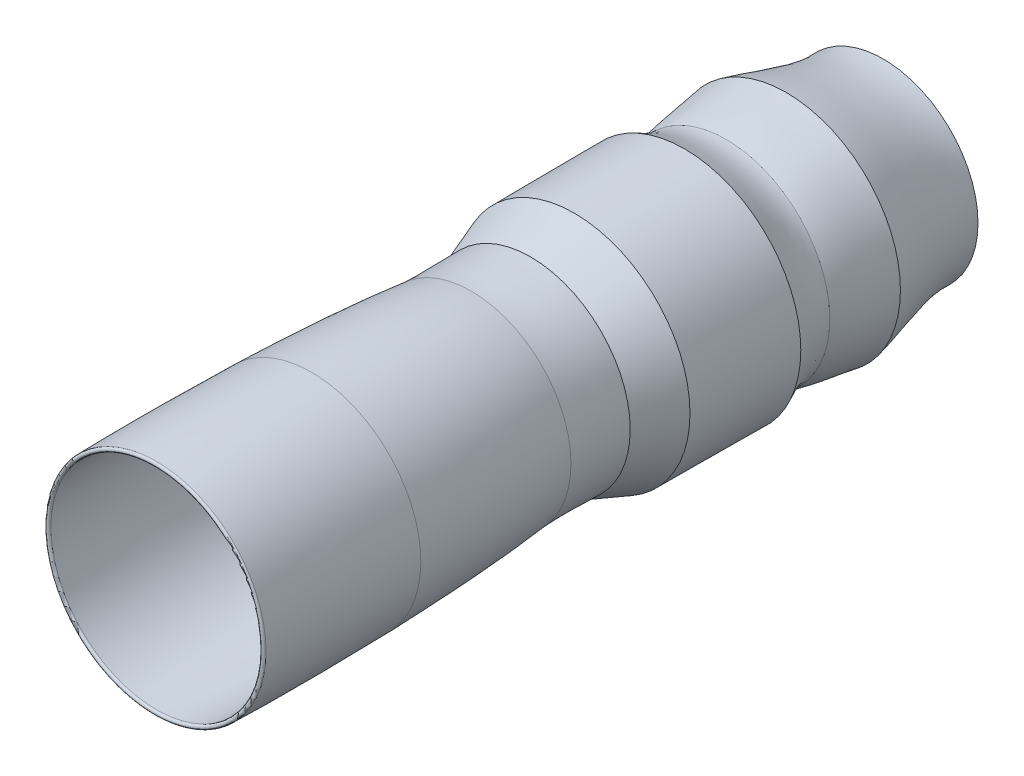
ISO-10303-21;
HEADER;
FILE_DESCRIPTION(('STEP AP214'),'2;1');
FILE_NAME('part.step','',(''),(''),'','','');
FILE_SCHEMA(('AUTOMOTIVE_DESIGN { 1 0 10303 214 1 1 1 1 }'));
ENDSEC;
DATA;
#1=APPLICATION_CONTEXT('core data for automotive mechanical design processes');
#2=APPLICATION_PROTOCOL_DEFINITION('international standard','automotive_design',2000,#1);
#3=PRODUCT_CONTEXT('',#1,'mechanical');
#4=PRODUCT('Part','Part','',(#3));
#5=PRODUCT_RELATED_PRODUCT_CATEGORY('part','',(#4));
#6=PRODUCT_DEFINITION_FORMATION('','',#4);
#7=PRODUCT_DEFINITION_CONTEXT('part definition',#1,'design');
#8=PRODUCT_DEFINITION('design','',#6,#7);
#9=PRODUCT_DEFINITION_SHAPE('','',#8);
#10=(LENGTH_UNIT() NAMED_UNIT(*) SI_UNIT(.MILLI.,.METRE.));
#11=(NAMED_UNIT(*) PLANE_ANGLE_UNIT() SI_UNIT($,.RADIAN.));
#12=(NAMED_UNIT(*) SI_UNIT($,.STERADIAN.) SOLID_ANGLE_UNIT());
#13=UNCERTAINTY_MEASURE_WITH_UNIT(LENGTH_MEASURE(1.E-05),#10,'distance_accuracy_value','');
#14=(GEOMETRIC_REPRESENTATION_CONTEXT(3) GLOBAL_UNCERTAINTY_ASSIGNED_CONTEXT((#13)) GLOBAL_UNIT_ASSIGNED_CONTEXT((#10,
#11,#12)) REPRESENTATION_CONTEXT('',''));
#15=CARTESIAN_POINT('',(0.,0.,0.));
#16=DIRECTION('',(0.,0.,1.));
#17=DIRECTION('',(1.,0.,0.));
#18=AXIS2_PLACEMENT_3D('',#15,#16,#17);
#19=CARTESIAN_POINT('',(0.,753.494292529718,-356.161187989445));
#20=CARTESIAN_POINT('',(0.,760.172113123118,-725.110775774774));
#21=CARTESIAN_POINT('',(0.,758.434084398831,-1094.10200615055));
#22=CARTESIAN_POINT('',(0.,750.66302289733,-1463.187614253));
#23=B_SPLINE_CURVE_WITH_KNOTS('',3,(#19,#20,#21,#22),.UNSPECIFIED.,.F.,.F.,(4,4),(0.,1.),.UNSPECIFIED.);
#24=CARTESIAN_POINT('',(0.,0.,0.));
#25=DIRECTION('',(0.,0.,1.));
#26=AXIS1_PLACEMENT('',#24,#25);
#27=SURFACE_OF_REVOLUTION('',#23,#26);
#28=CARTESIAN_POINT('',(0.,0.,-1463.187614253));
#29=DIRECTION('',(0.,0.,1.));
#30=DIRECTION('',(1.,0.,0.));
#31=AXIS2_PLACEMENT_3D('',#28,#29,#30);
#32=CIRCLE('',#31,750.66302289733);
#33=CARTESIAN_POINT('',(750.66302289733,0.,-1463.187614253));
#34=VERTEX_POINT('',#33);
#35=EDGE_CURVE('E10',#34,#34,#32,.T.);
#36=ORIENTED_EDGE('',*,*,#35,.F.);
#37=EDGE_LOOP('',(#36));
#38=FACE_BOUND('',#37,.T.);
#39=CARTESIAN_POINT('',(0.,0.,-356.161187989445));
#40=DIRECTION('',(0.,0.,1.));
#41=DIRECTION('',(1.,0.,0.));
#42=AXIS2_PLACEMENT_3D('',#39,#40,#41);
#43=CIRCLE('',#42,753.494292529718);
#44=CARTESIAN_POINT('',(753.494292529718,0.,-356.161187989445));
#45=VERTEX_POINT('',#44);
#46=EDGE_CURVE('E92',#45,#45,#43,.T.);
#47=ORIENTED_EDGE('',*,*,#46,.T.);
#48=EDGE_LOOP('',(#47));
#49=FACE_BOUND('',#48,.T.);
#50=ADVANCED_FACE('F33',(#38,#49),#27,.T.);
#51=CARTESIAN_POINT('',(0.,750.66302289733,-1463.187614253));
#52=CARTESIAN_POINT('',(0.,737.201686938237,-1843.51900634968));
#53=CARTESIAN_POINT('',(0.,724.679123309834,-2224.42989755984));
#54=CARTESIAN_POINT('',(0.,681.874551433211,-2602.8220839904));
#55=B_SPLINE_CURVE_WITH_KNOTS('',3,(#51,#52,#53,#54),.UNSPECIFIED.,.F.,.F.,(4,4),(0.,1.),.UNSPECIFIED.);
#56=CARTESIAN_POINT('',(0.,0.,0.));
#57=DIRECTION('',(0.,0.,1.));
#58=AXIS1_PLACEMENT('',#56,#57);
#59=SURFACE_OF_REVOLUTION('',#55,#58);
#60=CARTESIAN_POINT('',(0.,0.,-2602.8220839904));
#61=DIRECTION('',(0.,0.,1.));
#62=DIRECTION('',(1.,0.,0.));
#63=AXIS2_PLACEMENT_3D('',#60,#61,#62);
#64=CIRCLE('',#63,681.874551433211);
#65=CARTESIAN_POINT('',(681.874551433211,0.,-2602.8220839904));
#66=VERTEX_POINT('',#65);
#67=EDGE_CURVE('E40',#66,#66,#64,.T.);
#68=ORIENTED_EDGE('',*,*,#67,.F.);
#69=EDGE_LOOP('',(#68));
#70=FACE_BOUND('',#69,.T.);
#71=ORIENTED_EDGE('',*,*,#35,.T.);
#72=EDGE_LOOP('',(#71));
#73=FACE_BOUND('',#72,.T.);
#74=ADVANCED_FACE('F210',(#70,#73),#59,.T.);
#75=CARTESIAN_POINT('',(0.,681.874551433211,-2602.8220839904));
#76=CARTESIAN_POINT('',(0.,673.149714518346,-2746.4510287299));
#77=CARTESIAN_POINT('',(0.,679.394025231765,-2890.10518217993));
#78=CARTESIAN_POINT('',(0.,681.748596070962,-3034.50316192965));
#79=B_SPLINE_CURVE_WITH_KNOTS('',3,(#75,#76,#77,#78),.UNSPECIFIED.,.F.,.F.,(4,4),(0.,1.),.UNSPECIFIED.);
#80=CARTESIAN_POINT('',(0.,0.,0.));
#81=DIRECTION('',(0.,0.,1.));
#82=AXIS1_PLACEMENT('',#80,#81);
#83=SURFACE_OF_REVOLUTION('',#79,#82);
#84=CARTESIAN_POINT('',(0.,0.,-3034.50316192965));
#85=DIRECTION('',(0.,0.,1.));
#86=DIRECTION('',(1.,0.,0.));
#87=AXIS2_PLACEMENT_3D('',#84,#85,#86);
#88=CIRCLE('',#87,681.748596070962);
#89=CARTESIAN_POINT('',(681.748596070962,0.,-3034.50316192965));
#90=VERTEX_POINT('',#89);
#91=EDGE_CURVE('E44',#90,#90,#88,.T.);
#92=ORIENTED_EDGE('',*,*,#91,.F.);
#93=EDGE_LOOP('',(#92));
#94=FACE_BOUND('',#93,.T.);
#95=ORIENTED_EDGE('',*,*,#67,.T.);
#96=EDGE_LOOP('',(#95));
#97=FACE_BOUND('',#96,.T.);
#98=ADVANCED_FACE('F207',(#94,#97),#83,.T.);
#99=CARTESIAN_POINT('',(0.,0.,-3034.50316192965));
#100=DIRECTION('',(0.,0.,-1.));
#101=DIRECTION('',(-1.,0.,0.));
#102=AXIS2_PLACEMENT_3D('',#99,#100,#101);
#103=CONICAL_SURFACE('',#102,681.748596070962,0.349679327620041);
#104=CARTESIAN_POINT('',(0.,0.,-3347.18801790438));
#105=DIRECTION('',(0.,0.,1.));
#106=DIRECTION('',(1.,0.,0.));
#107=AXIS2_PLACEMENT_3D('',#104,#105,#106);
#108=CIRCLE('',#107,795.773861825972);
#109=CARTESIAN_POINT('',(795.773861825972,0.,-3347.18801790438));
#110=VERTEX_POINT('',#109);
#111=EDGE_CURVE('E48',#110,#110,#108,.T.);
#112=ORIENTED_EDGE('',*,*,#111,.F.);
#113=EDGE_LOOP('',(#112));
#114=FACE_BOUND('',#113,.T.);
#115=ORIENTED_EDGE('',*,*,#91,.T.);
#116=EDGE_LOOP('',(#115));
#117=FACE_BOUND('',#116,.T.);
#118=ADVANCED_FACE('F209',(#114,#117),#103,.F.);
#119=CARTESIAN_POINT('',(0.,0.,-3347.18801790438));
#120=DIRECTION('',(0.,0.,-1.));
#121=DIRECTION('',(-1.,0.,0.));
#122=AXIS2_PLACEMENT_3D('',#119,#120,#121);
#123=CONICAL_SURFACE('',#122,795.773861825972,0.00551040441850811);
#124=CARTESIAN_POINT('',(0.,0.,-4122.34696172726));
#125=DIRECTION('',(0.,0.,1.));
#126=DIRECTION('',(1.,0.,0.));
#127=AXIS2_PLACEMENT_3D('',#124,#125,#126);
#128=CIRCLE('',#127,800.045344329039);
#129=CARTESIAN_POINT('',(800.045344329039,0.,-4122.34696172726));
#130=VERTEX_POINT('',#129);
#131=EDGE_CURVE('E53',#130,#130,#128,.T.);
#132=ORIENTED_EDGE('',*,*,#131,.F.);
#133=EDGE_LOOP('',(#132));
#134=FACE_BOUND('',#133,.T.);
#135=ORIENTED_EDGE('',*,*,#111,.T.);
#136=EDGE_LOOP('',(#135));
#137=FACE_BOUND('',#136,.T.);
#138=ADVANCED_FACE('F186',(#134,#137),#123,.F.);
#139=CARTESIAN_POINT('',(0.,800.045344329039,-4122.34696172726));
#140=CARTESIAN_POINT('',(0.,754.252085999033,-4218.88190490379));
#141=CARTESIAN_POINT('',(0.,701.137630048925,-4321.24126433802));
#142=CARTESIAN_POINT('',(0.,711.434963380804,-4430.39299765593));
#143=B_SPLINE_CURVE_WITH_KNOTS('',3,(#139,#140,#141,#142),.UNSPECIFIED.,.F.,.F.,(4,4),(0.,1.),.UNSPECIFIED.);
#144=CARTESIAN_POINT('',(0.,0.,0.));
#145=DIRECTION('',(0.,0.,1.));
#146=AXIS1_PLACEMENT('',#144,#145);
#147=SURFACE_OF_REVOLUTION('',#143,#146);
#148=CARTESIAN_POINT('',(0.,0.,-4430.39299765593));
#149=DIRECTION('',(0.,0.,1.));
#150=DIRECTION('',(1.,0.,0.));
#151=AXIS2_PLACEMENT_3D('',#148,#149,#150);
#152=CIRCLE('',#151,711.434963380804);
#153=CARTESIAN_POINT('',(711.434963380804,0.,-4430.39299765593));
#154=VERTEX_POINT('',#153);
#155=EDGE_CURVE('E56',#154,#154,#152,.T.);
#156=ORIENTED_EDGE('',*,*,#155,.F.);
#157=EDGE_LOOP('',(#156));
#158=FACE_BOUND('',#157,.T.);
#159=ORIENTED_EDGE('',*,*,#131,.T.);
#160=EDGE_LOOP('',(#159));
#161=FACE_BOUND('',#160,.T.);
#162=ADVANCED_FACE('F182',(#158,#161),#147,.T.);
#163=CARTESIAN_POINT('',(0.,711.434963380804,-4430.39299765593));
#164=CARTESIAN_POINT('',(0.,749.566522084598,-4568.68704470257));
#165=CARTESIAN_POINT('',(0.,760.575182456363,-4711.69074306238));
#166=CARTESIAN_POINT('',(0.,784.956999196679,-4854.43054694721));
#167=B_SPLINE_CURVE_WITH_KNOTS('',3,(#163,#164,#165,#166),.UNSPECIFIED.,.F.,.F.,(4,4),(0.,1.),.UNSPECIFIED.);
#168=CARTESIAN_POINT('',(0.,0.,0.));
#169=DIRECTION('',(0.,0.,1.));
#170=AXIS1_PLACEMENT('',#168,#169);
#171=SURFACE_OF_REVOLUTION('',#167,#170);
#172=CARTESIAN_POINT('',(0.,0.,-4854.43054694721));
#173=DIRECTION('',(0.,0.,1.));
#174=DIRECTION('',(1.,0.,0.));
#175=AXIS2_PLACEMENT_3D('',#172,#173,#174);
#176=CIRCLE('',#175,784.956999196679);
#177=CARTESIAN_POINT('',(784.956999196679,0.,-4854.43054694721));
#178=VERTEX_POINT('',#177);
#179=EDGE_CURVE('E59',#178,#178,#176,.T.);
#180=ORIENTED_EDGE('',*,*,#179,.F.);
#181=EDGE_LOOP('',(#180));
#182=FACE_BOUND('',#181,.T.);
#183=ORIENTED_EDGE('',*,*,#155,.T.);
#184=EDGE_LOOP('',(#183));
#185=FACE_BOUND('',#184,.T.);
#186=ADVANCED_FACE('F178',(#182,#185),#171,.T.);
#187=CARTESIAN_POINT('',(0.,784.956999196679,-4854.43054694721));
#188=CARTESIAN_POINT('',(0.,731.788805229973,-5084.73900632817));
#189=CARTESIAN_POINT('',(0.,632.925530553312,-5313.76210592552));
#190=CARTESIAN_POINT('',(0.,646.823990311028,-5549.94392687975));
#191=B_SPLINE_CURVE_WITH_KNOTS('',3,(#187,#188,#189,#190),.UNSPECIFIED.,.F.,.F.,(4,4),(0.,1.),.UNSPECIFIED.);
#192=CARTESIAN_POINT('',(0.,0.,0.));
#193=DIRECTION('',(0.,0.,1.));
#194=AXIS1_PLACEMENT('',#192,#193);
#195=SURFACE_OF_REVOLUTION('',#191,#194);
#196=CARTESIAN_POINT('',(0.,0.,-5549.94392687975));
#197=DIRECTION('',(0.,0.,1.));
#198=DIRECTION('',(1.,0.,0.));
#199=AXIS2_PLACEMENT_3D('',#196,#197,#198);
#200=CIRCLE('',#199,646.823990311028);
#201=CARTESIAN_POINT('',(646.823990311028,0.,-5549.94392687975));
#202=VERTEX_POINT('',#201);
#203=EDGE_CURVE('E62',#202,#202,#200,.T.);
#204=ORIENTED_EDGE('',*,*,#203,.F.);
#205=EDGE_LOOP('',(#204));
#206=FACE_BOUND('',#205,.T.);
#207=ORIENTED_EDGE('',*,*,#179,.T.);
#208=EDGE_LOOP('',(#207));
#209=FACE_BOUND('',#208,.T.);
#210=ADVANCED_FACE('F175',(#206,#209),#195,.T.);
#211=CARTESIAN_POINT('',(0.,0.,-5549.94392687975));
#212=DIRECTION('',(0.,0.,1.));
#213=DIRECTION('',(1.,0.,0.));
#214=AXIS2_PLACEMENT_3D('',#211,#212,#213);
#215=CONICAL_SURFACE('',#214,646.823990311028,1.51201767082809);
#216=CARTESIAN_POINT('',(0.,0.,-5548.18158240619));
#217=DIRECTION('',(0.,0.,1.));
#218=DIRECTION('',(1.,0.,0.));
#219=AXIS2_PLACEMENT_3D('',#216,#217,#218);
#220=CIRCLE('',#219,676.772181274031);
#221=CARTESIAN_POINT('',(676.772181274031,0.,-5548.18158240619));
#222=VERTEX_POINT('',#221);
#223=EDGE_CURVE('E65',#222,#222,#220,.T.);
#224=ORIENTED_EDGE('',*,*,#223,.F.);
#225=EDGE_LOOP('',(#224));
#226=FACE_BOUND('',#225,.T.);
#227=ORIENTED_EDGE('',*,*,#203,.T.);
#228=EDGE_LOOP('',(#227));
#229=FACE_BOUND('',#228,.T.);
#230=ADVANCED_FACE('F154',(#226,#229),#215,.T.);
#231=CARTESIAN_POINT('',(0.,676.772181274031,-5548.18158240619));
#232=CARTESIAN_POINT('',(0.,676.352131069167,-5541.04350926667));
#233=CARTESIAN_POINT('',(0.,675.725036038863,-5526.74686761772));
#234=CARTESIAN_POINT('',(0.,675.2941946884,-5498.18751192436));
#235=CARTESIAN_POINT('',(0.,676.603538111146,-5448.20501750447));
#236=CARTESIAN_POINT('',(0.,686.729597193146,-5348.18281717795));
#237=CARTESIAN_POINT('',(0.,712.040625005156,-5233.44105970244));
#238=CARTESIAN_POINT('',(0.,743.891870354484,-5118.00726837653));
#239=CARTESIAN_POINT('',(0.,764.958688545958,-5045.51316998351));
#240=CARTESIAN_POINT('',(0.,781.559982232107,-4987.25850384506));
#241=CARTESIAN_POINT('',(0.,791.629753436414,-4950.72925745997));
#242=CARTESIAN_POINT('',(0.,799.380997483894,-4921.4238544388));
#243=CARTESIAN_POINT('',(0.,805.010943090144,-4899.40609525439));
#244=CARTESIAN_POINT('',(0.,809.526163208365,-4881.00858057863));
#245=CARTESIAN_POINT('',(0.,812.576596176374,-4868.13349104235));
#246=CARTESIAN_POINT('',(0.,814.292241129079,-4860.73320326822));
#247=CARTESIAN_POINT('',(0.,815.123374490179,-4857.12775864705));
#248=CARTESIAN_POINT('',(0.,815.542277310136,-4855.31319892822));
#249=B_SPLINE_CURVE_WITH_KNOTS('',3,(#231,#232,#233,#234,#235,#236,#237,#238,#239,#240,#241,
#242,#243,#244,#245,#246,#247,#248),.UNSPECIFIED.,.F.,.F.,(4,1,1,1,1,1,1,1,1,1,1,1,1,1,1,4),
(-0.00848941733885234,0.0230258769529867,0.0545411712448259,0.117571759828504,0.243632936995861,
0.495755291330574,0.62181646849793,0.747877645665287,0.810908234248965,0.873938822832643,
0.905454117124483,0.936969411416322,0.968484705708161,0.98424235285408,0.99212117642704,1.),.UNSPECIFIED.);
#250=CARTESIAN_POINT('',(0.,0.,0.));
#251=DIRECTION('',(0.,0.,1.));
#252=AXIS1_PLACEMENT('',#250,#251);
#253=SURFACE_OF_REVOLUTION('',#249,#252);
#254=CARTESIAN_POINT('',(0.,0.,-4855.31319892822));
#255=DIRECTION('',(0.,0.,1.));
#256=DIRECTION('',(1.,0.,0.));
#257=AXIS2_PLACEMENT_3D('',#254,#255,#256);
#258=CIRCLE('',#257,815.542277310136);
#259=CARTESIAN_POINT('',(815.542277310136,0.,-4855.31319892822));
#260=VERTEX_POINT('',#259);
#261=EDGE_CURVE('E68',#260,#260,#258,.T.);
#262=ORIENTED_EDGE('',*,*,#261,.F.);
#263=EDGE_LOOP('',(#262));
#264=FACE_BOUND('',#263,.T.);
#265=ORIENTED_EDGE('',*,*,#223,.T.);
#266=EDGE_LOOP('',(#265));
#267=FACE_BOUND('',#266,.T.);
#268=ADVANCED_FACE('F150',(#264,#267),#253,.T.);
#269=CARTESIAN_POINT('',(0.,815.542277310136,-4855.31319892822));
#270=CARTESIAN_POINT('',(0.,815.158959557686,-4853.06912083539));
#271=CARTESIAN_POINT('',(0.,814.386269826998,-4848.55896008673));
#272=CARTESIAN_POINT('',(0.,812.890423572662,-4839.71448731302));
#273=CARTESIAN_POINT('',(0.,810.324099496809,-4824.13715137991));
#274=CARTESIAN_POINT('',(0.,805.424815972396,-4792.98530694584));
#275=CARTESIAN_POINT('',(0.,798.917989513476,-4748.30485789265));
#276=CARTESIAN_POINT('',(0.,791.428480224709,-4694.52332460797));
#277=CARTESIAN_POINT('',(0.,783.77091840881,-4640.61749949156));
#278=CARTESIAN_POINT('',(0.,775.453966909792,-4586.64978942357));
#279=CARTESIAN_POINT('',(0.,765.979438744741,-4532.68335172904));
#280=CARTESIAN_POINT('',(0.,756.694902193538,-4487.75585449538));
#281=CARTESIAN_POINT('',(0.,748.184484982196,-4451.90049419496));
#282=CARTESIAN_POINT('',(0.,743.514228364451,-4433.96738995953));
#283=CARTESIAN_POINT('',(0.,741.07598185685,-4425.04290165153));
#284=B_SPLINE_CURVE_WITH_KNOTS('',3,(#269,#270,#271,#272,#273,#274,#275,#276,#277,#278,#279,
#280,#281,#282,#283),.UNSPECIFIED.,.F.,.F.,(4,1,1,1,1,1,1,1,1,1,1,1,4),(0.00616043377017012,
0.0219056942910551,0.0376509548119402,0.0691414758537103,0.132122517937251,0.258084602104331,
0.384046686271411,0.510008770438492,0.635970854605572,0.761932938772653,0.887895022939733,
0.950876065023273,1.01385710710681),.UNSPECIFIED.);
#285=CARTESIAN_POINT('',(0.,0.,0.));
#286=DIRECTION('',(0.,0.,1.));
#287=AXIS1_PLACEMENT('',#285,#286);
#288=SURFACE_OF_REVOLUTION('',#284,#287);
#289=CARTESIAN_POINT('',(0.,0.,-4425.04290165153));
#290=DIRECTION('',(0.,0.,1.));
#291=DIRECTION('',(1.,0.,0.));
#292=AXIS2_PLACEMENT_3D('',#289,#290,#291);
#293=CIRCLE('',#292,741.07598185685);
#294=CARTESIAN_POINT('',(741.07598185685,0.,-4425.04290165153));
#295=VERTEX_POINT('',#294);
#296=EDGE_CURVE('E71',#295,#295,#293,.T.);
#297=ORIENTED_EDGE('',*,*,#296,.F.);
#298=EDGE_LOOP('',(#297));
#299=FACE_BOUND('',#298,.T.);
#300=ORIENTED_EDGE('',*,*,#261,.T.);
#301=EDGE_LOOP('',(#300));
#302=FACE_BOUND('',#301,.T.);
#303=ADVANCED_FACE('F146',(#299,#302),#288,.T.);
#304=CARTESIAN_POINT('',(0.,741.07598185685,-4425.04290165153));
#305=CARTESIAN_POINT('',(0.,740.815380432156,-4421.95692405446));
#306=CARTESIAN_POINT('',(0.,740.404357827247,-4415.76670869507));
#307=CARTESIAN_POINT('',(0.,740.018984614183,-4403.43284473365));
#308=CARTESIAN_POINT('',(0.,740.324436863655,-4388.03275259886));
#309=CARTESIAN_POINT('',(0.,741.870996983748,-4369.56885079321));
#310=CARTESIAN_POINT('',(0.,745.400757085936,-4344.94055658249));
#311=CARTESIAN_POINT('',(0.,752.368476012507,-4314.11177125857));
#312=CARTESIAN_POINT('',(0.,764.149954960433,-4277.04446342954));
#313=CARTESIAN_POINT('',(0.,778.621025858601,-4239.95600724992));
#314=CARTESIAN_POINT('',(0.,794.999175573431,-4202.90033046434));
#315=CARTESIAN_POINT('',(0.,809.559364708015,-4172.07095777087));
#316=CARTESIAN_POINT('',(0.,819.859795459181,-4150.52246882836));
#317=CARTESIAN_POINT('',(0.,824.99596252828,-4139.74529574593));
#318=CARTESIAN_POINT('',(0.,827.911611235236,-4133.59998298186));
#319=CARTESIAN_POINT('',(0.,829.357974854108,-4130.55078645366));
#320=CARTESIAN_POINT('',(0.,830.08258925537,-4129.02325570784));
#321=B_SPLINE_CURVE_WITH_KNOTS('',3,(#304,#305,#306,#307,#308,#309,#310,#311,#312,#313,#314,
#315,#316,#317,#318,#319,#320),.UNSPECIFIED.,.F.,.F.,(4,1,1,1,1,1,1,1,1,1,1,1,1,1,4),
(-0.0213445024231735,0.0103027062571887,0.041949914937551,0.105244332298275,0.168538749659,
0.231833167019724,0.358422001741173,0.485010836462622,0.611599671184071,0.738188505905519,
0.864777340626968,0.928071757987693,0.959718966668055,0.975542571008236,0.991366175348417),.UNSPECIFIED.);
#322=CARTESIAN_POINT('',(0.,0.,0.));
#323=DIRECTION('',(0.,0.,1.));
#324=AXIS1_PLACEMENT('',#322,#323);
#325=SURFACE_OF_REVOLUTION('',#321,#324);
#326=CARTESIAN_POINT('',(0.,0.,-4129.02325570784));
#327=DIRECTION('',(0.,0.,1.));
#328=DIRECTION('',(1.,0.,0.));
#329=AXIS2_PLACEMENT_3D('',#326,#327,#328);
#330=CIRCLE('',#329,830.08258925537);
#331=CARTESIAN_POINT('',(830.08258925537,0.,-4129.02325570784));
#332=VERTEX_POINT('',#331);
#333=EDGE_CURVE('E74',#332,#332,#330,.T.);
#334=ORIENTED_EDGE('',*,*,#333,.F.);
#335=EDGE_LOOP('',(#334));
#336=FACE_BOUND('',#335,.T.);
#337=ORIENTED_EDGE('',*,*,#296,.T.);
#338=EDGE_LOOP('',(#337));
#339=FACE_BOUND('',#338,.T.);
#340=ADVANCED_FACE('F142',(#336,#339),#325,.T.);
#341=CARTESIAN_POINT('',(0.,0.,-4129.02325570784));
#342=DIRECTION('',(0.,0.,-1.));
#343=DIRECTION('',(-1.,0.,0.));
#344=AXIS2_PLACEMENT_3D('',#341,#342,#343);
#345=CONICAL_SURFACE('',#344,830.08258925537,0.0055104044185073);
#346=CARTESIAN_POINT('',(0.,0.,-3341.80868149445));
#347=DIRECTION('',(0.,0.,1.));
#348=DIRECTION('',(1.,0.,0.));
#349=AXIS2_PLACEMENT_3D('',#346,#347,#348);
#350=CIRCLE('',#349,825.744674680937);
#351=CARTESIAN_POINT('',(825.744674680937,0.,-3341.80868149445));
#352=VERTEX_POINT('',#351);
#353=EDGE_CURVE('E77',#352,#352,#350,.T.);
#354=ORIENTED_EDGE('',*,*,#353,.F.);
#355=EDGE_LOOP('',(#354));
#356=FACE_BOUND('',#355,.T.);
#357=ORIENTED_EDGE('',*,*,#333,.T.);
#358=EDGE_LOOP('',(#357));
#359=FACE_BOUND('',#358,.T.);
#360=ADVANCED_FACE('F145',(#356,#359),#345,.T.);
#361=CARTESIAN_POINT('',(0.,0.,-3341.80868149445));
#362=DIRECTION('',(0.,0.,-1.));
#363=DIRECTION('',(-1.,0.,0.));
#364=AXIS2_PLACEMENT_3D('',#361,#362,#363);
#365=CONICAL_SURFACE('',#364,825.744674680937,0.34967932762004);
#366=CARTESIAN_POINT('',(0.,0.,-3028.96279303042));
#367=DIRECTION('',(0.,0.,1.));
#368=DIRECTION('',(1.,0.,0.));
#369=AXIS2_PLACEMENT_3D('',#366,#367,#368);
#370=CIRCLE('',#369,711.660685991201);
#371=CARTESIAN_POINT('',(711.660685991201,0.,-3028.96279303042));
#372=VERTEX_POINT('',#371);
#373=EDGE_CURVE('E80',#372,#372,#370,.T.);
#374=ORIENTED_EDGE('',*,*,#373,.F.);
#375=EDGE_LOOP('',(#374));
#376=FACE_BOUND('',#375,.T.);
#377=ORIENTED_EDGE('',*,*,#353,.T.);
#378=EDGE_LOOP('',(#377));
#379=FACE_BOUND('',#378,.T.);
#380=ADVANCED_FACE('F120',(#376,#379),#365,.T.);
#381=CARTESIAN_POINT('',(0.,711.660685991201,-3028.96279303042));
#382=CARTESIAN_POINT('',(0.,711.50968167977,-3020.03632875635));
#383=CARTESIAN_POINT('',(0.,711.179397468735,-3002.1730984374));
#384=CARTESIAN_POINT('',(0.,710.443606042593,-2966.53436317964));
#385=CARTESIAN_POINT('',(0.,709.448541620536,-2922.08803226635));
#386=CARTESIAN_POINT('',(0.,708.34665465512,-2868.92703100827));
#387=CARTESIAN_POINT('',(0.,707.281388372248,-2798.26072600625));
#388=CARTESIAN_POINT('',(0.,707.241423031354,-2727.90798794865));
#389=CARTESIAN_POINT('',(0.,709.056653332951,-2657.82271127126));
#390=CARTESIAN_POINT('',(0.,710.718095399234,-2622.88173738543));
#391=CARTESIAN_POINT('',(0.,711.772441422587,-2605.41579603784));
#392=B_SPLINE_CURVE_WITH_KNOTS('',3,(#381,#382,#383,#384,#385,#386,#387,#388,#389,#390,#391),
.UNSPECIFIED.,.F.,.F.,(4,1,1,1,1,1,1,1,4),(0.00182420882666894,0.063484013038604,
0.125143817250539,0.248463425674409,0.371783034098279,0.495102642522149,0.74174185936989,
0.86506146779376,0.98838107621763),.UNSPECIFIED.);
#393=CARTESIAN_POINT('',(0.,0.,0.));
#394=DIRECTION('',(0.,0.,1.));
#395=AXIS1_PLACEMENT('',#393,#394);
#396=SURFACE_OF_REVOLUTION('',#392,#395);
#397=CARTESIAN_POINT('',(0.,0.,-2605.41579603784));
#398=DIRECTION('',(0.,0.,1.));
#399=DIRECTION('',(1.,0.,0.));
#400=AXIS2_PLACEMENT_3D('',#397,#398,#399);
#401=CIRCLE('',#400,711.772441422587);
#402=CARTESIAN_POINT('',(711.772441422587,0.,-2605.41579603784));
#403=VERTEX_POINT('',#402);
#404=EDGE_CURVE('E83',#403,#403,#401,.T.);
#405=ORIENTED_EDGE('',*,*,#404,.F.);
#406=EDGE_LOOP('',(#405));
#407=FACE_BOUND('',#406,.T.);
#408=ORIENTED_EDGE('',*,*,#373,.T.);
#409=EDGE_LOOP('',(#408));
#410=FACE_BOUND('',#409,.T.);
#411=ADVANCED_FACE('F116',(#407,#410),#396,.T.);
#412=CARTESIAN_POINT('',(0.,711.772441422587,-2605.41579603784));
#413=CARTESIAN_POINT('',(0.,714.454287877616,-2581.68515145774));
#414=CARTESIAN_POINT('',(0.,719.582573849798,-2534.18857934473));
#415=CARTESIAN_POINT('',(0.,728.946658300003,-2439.17085333128));
#416=CARTESIAN_POINT('',(0.,743.160607478179,-2272.77126055153));
#417=CARTESIAN_POINT('',(0.,758.175994513519,-2034.84401448336));
#418=CARTESIAN_POINT('',(0.,768.592940988569,-1796.87811263833));
#419=CARTESIAN_POINT('',(0.,775.635784606693,-1606.60339240067));
#420=CARTESIAN_POINT('',(0.,778.969531439607,-1511.56560782749));
#421=CARTESIAN_POINT('',(0.,780.651851550266,-1464.03398454855));
#422=B_SPLINE_CURVE_WITH_KNOTS('',3,(#412,#413,#414,#415,#416,#417,#418,#419,#420,#421),
.UNSPECIFIED.,.F.,.F.,(4,1,1,1,1,1,1,4),(-0.000188236119624683,0.0622808481707129,
0.124749932461051,0.249688101041726,0.499564438203076,0.749440775364427,0.874378943945102,
0.999317112525777),.UNSPECIFIED.);
#423=CARTESIAN_POINT('',(0.,0.,0.));
#424=DIRECTION('',(0.,0.,1.));
#425=AXIS1_PLACEMENT('',#423,#424);
#426=SURFACE_OF_REVOLUTION('',#422,#425);
#427=CARTESIAN_POINT('',(0.,0.,-1464.03398454855));
#428=DIRECTION('',(0.,0.,1.));
#429=DIRECTION('',(1.,0.,0.));
#430=AXIS2_PLACEMENT_3D('',#427,#428,#429);
#431=CIRCLE('',#430,780.651851550266);
#432=CARTESIAN_POINT('',(780.651851550266,0.,-1464.03398454855));
#433=VERTEX_POINT('',#432);
#434=EDGE_CURVE('E86',#433,#433,#431,.T.);
#435=ORIENTED_EDGE('',*,*,#434,.F.);
#436=EDGE_LOOP('',(#435));
#437=FACE_BOUND('',#436,.T.);
#438=ORIENTED_EDGE('',*,*,#404,.T.);
#439=EDGE_LOOP('',(#438));
#440=FACE_BOUND('',#439,.T.);
#441=ADVANCED_FACE('F112',(#437,#440),#426,.T.);
#442=CARTESIAN_POINT('',(0.,780.651851550266,-1464.03398454855));
#443=CARTESIAN_POINT('',(0.,782.596523982018,-1371.6720071154));
#444=CARTESIAN_POINT('',(0.,785.733695062832,-1186.92115283556));
#445=CARTESIAN_POINT('',(0.,787.948549260522,-909.823559131321));
#446=CARTESIAN_POINT('',(0.,787.451178042234,-632.727325382606));
#447=CARTESIAN_POINT('',(0.,785.161059655169,-447.978600689151));
#448=CARTESIAN_POINT('',(0.,783.48937983241,-355.618290481704));
#449=B_SPLINE_CURVE_WITH_KNOTS('',3,(#442,#443,#444,#445,#446,#447,#448),.UNSPECIFIED.,.F.,.F.,
(4,1,1,1,4),(0.,0.250048512498633,0.500097024997266,0.750145537495899,1.00019404999453),.UNSPECIFIED.);
#450=CARTESIAN_POINT('',(0.,0.,0.));
#451=DIRECTION('',(0.,0.,1.));
#452=AXIS1_PLACEMENT('',#450,#451);
#453=SURFACE_OF_REVOLUTION('',#449,#452);
#454=CARTESIAN_POINT('',(0.,0.,-355.618290481704));
#455=DIRECTION('',(0.,0.,1.));
#456=DIRECTION('',(1.,0.,0.));
#457=AXIS2_PLACEMENT_3D('',#454,#455,#456);
#458=CIRCLE('',#457,783.48937983241);
#459=CARTESIAN_POINT('',(783.48937983241,0.,-355.618290481704));
#460=VERTEX_POINT('',#459);
#461=EDGE_CURVE('E89',#460,#460,#458,.T.);
#462=ORIENTED_EDGE('',*,*,#461,.F.);
#463=EDGE_LOOP('',(#462));
#464=FACE_BOUND('',#463,.T.);
#465=ORIENTED_EDGE('',*,*,#434,.T.);
#466=EDGE_LOOP('',(#465));
#467=FACE_BOUND('',#466,.T.);
#468=ADVANCED_FACE('F107',(#464,#467),#453,.T.);
#469=CARTESIAN_POINT('',(0.,0.,-355.889739235574));
#470=DIRECTION('',(0.,0.,1.));
#471=DIRECTION('',(1.,0.,0.));
#472=AXIS2_PLACEMENT_3D('',#469,#470,#471);
#473=TOROIDAL_SURFACE('',#472,768.491836181064,15.);
#474=ORIENTED_EDGE('',*,*,#46,.F.);
#475=EDGE_LOOP('',(#474));
#476=FACE_BOUND('',#475,.T.);
#477=ORIENTED_EDGE('',*,*,#461,.T.);
#478=EDGE_LOOP('',(#477));
#479=FACE_BOUND('',#478,.T.);
#480=ADVANCED_FACE('F111',(#476,#479),#473,.T.);
#481=CLOSED_SHELL('',(#50,#74,#98,#118,#138,#162,#186,#210,#230,#268,#303,#340,#360,#380,#411,
#441,#468,#480));
#482=MANIFOLD_SOLID_BREP('B2',#481);
#483=ADVANCED_BREP_SHAPE_REPRESENTATION('',(#18,#482),#14);
#484=SHAPE_DEFINITION_REPRESENTATION(#9,#483);
ENDSEC;
END-ISO-10303-21;
